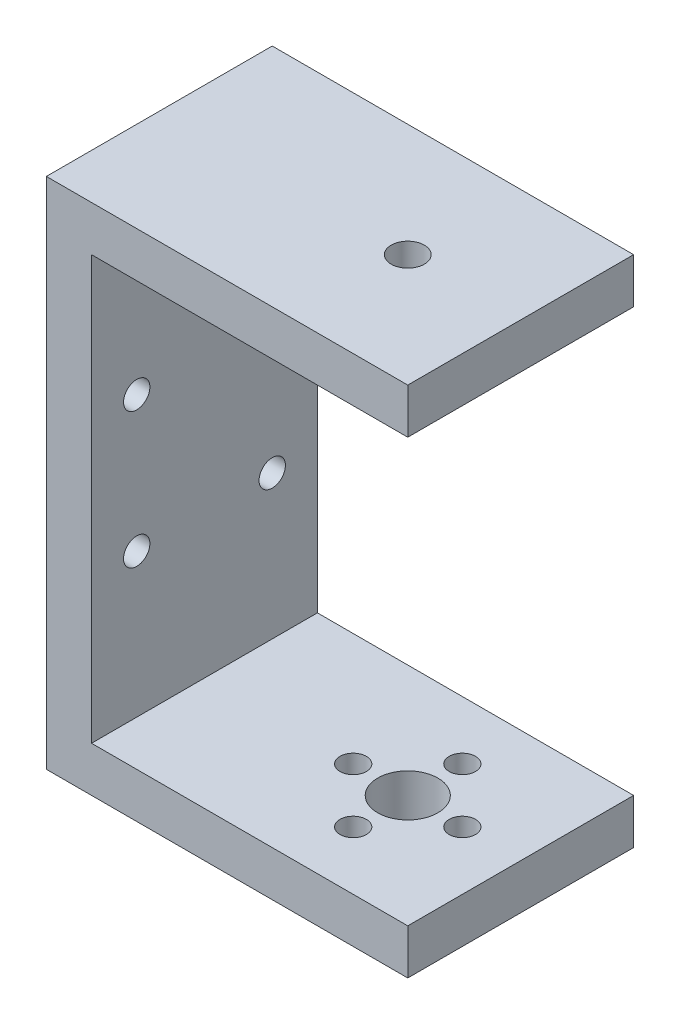
ISO-10303-21;
HEADER;
FILE_DESCRIPTION(('STEP AP214'),'2;1');
FILE_NAME('part.step','',(''),(''),'','','');
FILE_SCHEMA(('AUTOMOTIVE_DESIGN { 1 0 10303 214 1 1 1 1 }'));
ENDSEC;
DATA;
#1=APPLICATION_CONTEXT('core data for automotive mechanical design processes');
#2=APPLICATION_PROTOCOL_DEFINITION('international standard','automotive_design',2000,#1);
#3=PRODUCT_CONTEXT('',#1,'mechanical');
#4=PRODUCT('Part','Part','',(#3));
#5=PRODUCT_RELATED_PRODUCT_CATEGORY('part','',(#4));
#6=PRODUCT_DEFINITION_FORMATION('','',#4);
#7=PRODUCT_DEFINITION_CONTEXT('part definition',#1,'design');
#8=PRODUCT_DEFINITION('design','',#6,#7);
#9=PRODUCT_DEFINITION_SHAPE('','',#8);
#10=(LENGTH_UNIT() NAMED_UNIT(*) SI_UNIT(.MILLI.,.METRE.));
#11=(NAMED_UNIT(*) PLANE_ANGLE_UNIT() SI_UNIT($,.RADIAN.));
#12=(NAMED_UNIT(*) SI_UNIT($,.STERADIAN.) SOLID_ANGLE_UNIT());
#13=UNCERTAINTY_MEASURE_WITH_UNIT(LENGTH_MEASURE(1.E-05),#10,'distance_accuracy_value','');
#14=(GEOMETRIC_REPRESENTATION_CONTEXT(3) GLOBAL_UNCERTAINTY_ASSIGNED_CONTEXT((#13)) GLOBAL_UNIT_ASSIGNED_CONTEXT((#10,
#11,#12)) REPRESENTATION_CONTEXT('',''));
#15=CARTESIAN_POINT('',(0.,0.,0.));
#16=DIRECTION('',(0.,0.,1.));
#17=DIRECTION('',(1.,0.,0.));
#18=AXIS2_PLACEMENT_3D('',#15,#16,#17);
#19=CARTESIAN_POINT('',(24.,-34.1,30.));
#20=DIRECTION('',(-1.,0.,0.));
#21=DIRECTION('',(0.,0.,1.));
#22=AXIS2_PLACEMENT_3D('',#19,#20,#21);
#23=PLANE('',#22);
#24=DIRECTION('',(0.,1.,0.));
#25=VECTOR('',#24,1.);
#26=CARTESIAN_POINT('',(24.,-34.1,30.));
#27=LINE('',#26,#25);
#28=CARTESIAN_POINT('',(24.,28.1,30.));
#29=VERTEX_POINT('',#28);
#30=CARTESIAN_POINT('',(24.,34.1,30.));
#31=VERTEX_POINT('',#30);
#32=EDGE_CURVE('E87',#29,#31,#27,.T.);
#33=ORIENTED_EDGE('',*,*,#32,.F.);
#34=DIRECTION('',(0.,0.,1.));
#35=VECTOR('',#34,1.);
#36=CARTESIAN_POINT('',(24.,28.1,0.));
#37=LINE('',#36,#35);
#38=CARTESIAN_POINT('',(24.,28.1,0.));
#39=VERTEX_POINT('',#38);
#40=EDGE_CURVE('E145',#39,#29,#37,.T.);
#41=ORIENTED_EDGE('',*,*,#40,.F.);
#42=DIRECTION('',(0.,1.,0.));
#43=VECTOR('',#42,1.);
#44=CARTESIAN_POINT('',(24.,-34.1,0.));
#45=LINE('',#44,#43);
#46=CARTESIAN_POINT('',(24.,34.1,0.));
#47=VERTEX_POINT('',#46);
#48=EDGE_CURVE('E144',#39,#47,#45,.T.);
#49=ORIENTED_EDGE('',*,*,#48,.T.);
#50=DIRECTION('',(0.,0.,-1.));
#51=VECTOR('',#50,1.);
#52=CARTESIAN_POINT('',(24.,34.1,30.));
#53=LINE('',#52,#51);
#54=EDGE_CURVE('E11',#31,#47,#53,.T.);
#55=ORIENTED_EDGE('',*,*,#54,.F.);
#56=EDGE_LOOP('',(#33,#41,#49,#55));
#57=FACE_BOUND('',#56,.T.);
#58=ADVANCED_FACE('F33',(#57),#23,.F.);
#59=CARTESIAN_POINT('',(24.,-34.1,0.));
#60=VERTEX_POINT('',#59);
#61=CARTESIAN_POINT('',(24.,-28.1,0.));
#62=VERTEX_POINT('',#61);
#63=EDGE_CURVE('E156',#60,#62,#45,.T.);
#64=ORIENTED_EDGE('',*,*,#63,.T.);
#65=DIRECTION('',(0.,0.,1.));
#66=VECTOR('',#65,1.);
#67=CARTESIAN_POINT('',(24.,-28.1,0.));
#68=LINE('',#67,#66);
#69=CARTESIAN_POINT('',(24.,-28.1,30.));
#70=VERTEX_POINT('',#69);
#71=EDGE_CURVE('E50',#62,#70,#68,.T.);
#72=ORIENTED_EDGE('',*,*,#71,.T.);
#73=CARTESIAN_POINT('',(24.,-34.1,30.));
#74=VERTEX_POINT('',#73);
#75=EDGE_CURVE('E148',#74,#70,#27,.T.);
#76=ORIENTED_EDGE('',*,*,#75,.F.);
#77=DIRECTION('',(0.,0.,-1.));
#78=VECTOR('',#77,1.);
#79=CARTESIAN_POINT('',(24.,-34.1,30.));
#80=LINE('',#79,#78);
#81=EDGE_CURVE('E155',#74,#60,#80,.T.);
#82=ORIENTED_EDGE('',*,*,#81,.T.);
#83=EDGE_LOOP('',(#64,#72,#76,#82));
#84=FACE_BOUND('',#83,.T.);
#85=ADVANCED_FACE('F35',(#84),#23,.F.);
#86=CARTESIAN_POINT('',(-24.,34.1,30.));
#87=DIRECTION('',(0.,-1.,0.));
#88=DIRECTION('',(0.,0.,-1.));
#89=AXIS2_PLACEMENT_3D('',#86,#87,#88);
#90=PLANE('',#89);
#91=CARTESIAN_POINT('',(9.,34.1,15.));
#92=DIRECTION('',(0.,1.,0.));
#93=DIRECTION('',(0.,0.,1.));
#94=AXIS2_PLACEMENT_3D('',#91,#92,#93);
#95=CIRCLE('',#94,2.2);
#96=CARTESIAN_POINT('',(9.,34.1,17.2));
#97=VERTEX_POINT('',#96);
#98=EDGE_CURVE('E253',#97,#97,#95,.T.);
#99=ORIENTED_EDGE('',*,*,#98,.F.);
#100=EDGE_LOOP('',(#99));
#101=FACE_BOUND('',#100,.T.);
#102=DIRECTION('',(-1.,0.,0.));
#103=VECTOR('',#102,1.);
#104=CARTESIAN_POINT('',(-24.,34.1,0.));
#105=LINE('',#104,#103);
#106=CARTESIAN_POINT('',(-24.,34.1,0.));
#107=VERTEX_POINT('',#106);
#108=EDGE_CURVE('E158',#47,#107,#105,.T.);
#109=ORIENTED_EDGE('',*,*,#108,.T.);
#110=DIRECTION('',(0.,0.,-1.));
#111=VECTOR('',#110,1.);
#112=CARTESIAN_POINT('',(-24.,34.1,30.));
#113=LINE('',#112,#111);
#114=CARTESIAN_POINT('',(-24.,34.1,30.));
#115=VERTEX_POINT('',#114);
#116=EDGE_CURVE('E42',#115,#107,#113,.T.);
#117=ORIENTED_EDGE('',*,*,#116,.F.);
#118=DIRECTION('',(-1.,0.,0.));
#119=VECTOR('',#118,1.);
#120=CARTESIAN_POINT('',(-24.,34.1,30.));
#121=LINE('',#120,#119);
#122=EDGE_CURVE('E150',#31,#115,#121,.T.);
#123=ORIENTED_EDGE('',*,*,#122,.F.);
#124=ORIENTED_EDGE('',*,*,#54,.T.);
#125=EDGE_LOOP('',(#109,#117,#123,#124));
#126=FACE_BOUND('',#125,.T.);
#127=ADVANCED_FACE('F207',(#101,#126),#90,.F.);
#128=CARTESIAN_POINT('',(-24.,-34.1,30.));
#129=DIRECTION('',(1.,0.,0.));
#130=DIRECTION('',(0.,0.,-1.));
#131=AXIS2_PLACEMENT_3D('',#128,#129,#130);
#132=PLANE('',#131);
#133=CARTESIAN_POINT('',(-24.,9.00000000000002,24.));
#134=DIRECTION('',(1.,0.,0.));
#135=DIRECTION('',(0.,0.,1.));
#136=AXIS2_PLACEMENT_3D('',#133,#134,#135);
#137=CIRCLE('',#136,1.75);
#138=CARTESIAN_POINT('',(-24.,9.00000000000002,25.75));
#139=VERTEX_POINT('',#138);
#140=EDGE_CURVE('E330',#139,#139,#137,.T.);
#141=ORIENTED_EDGE('',*,*,#140,.T.);
#142=EDGE_LOOP('',(#141));
#143=FACE_BOUND('',#142,.T.);
#144=CARTESIAN_POINT('',(-24.,9.00000000000002,6.));
#145=DIRECTION('',(1.,0.,0.));
#146=DIRECTION('',(0.,0.,-1.));
#147=AXIS2_PLACEMENT_3D('',#144,#145,#146);
#148=CIRCLE('',#147,1.75);
#149=CARTESIAN_POINT('',(-24.,9.00000000000002,4.25));
#150=VERTEX_POINT('',#149);
#151=EDGE_CURVE('E321',#150,#150,#148,.T.);
#152=ORIENTED_EDGE('',*,*,#151,.T.);
#153=EDGE_LOOP('',(#152));
#154=FACE_BOUND('',#153,.T.);
#155=CARTESIAN_POINT('',(-24.,-9.,6.));
#156=DIRECTION('',(1.,0.,0.));
#157=DIRECTION('',(0.,0.,1.));
#158=AXIS2_PLACEMENT_3D('',#155,#156,#157);
#159=CIRCLE('',#158,1.75);
#160=CARTESIAN_POINT('',(-24.,-9.,7.75));
#161=VERTEX_POINT('',#160);
#162=EDGE_CURVE('E316',#161,#161,#159,.T.);
#163=ORIENTED_EDGE('',*,*,#162,.T.);
#164=EDGE_LOOP('',(#163));
#165=FACE_BOUND('',#164,.T.);
#166=CARTESIAN_POINT('',(-24.,-9.,24.));
#167=DIRECTION('',(1.,0.,0.));
#168=DIRECTION('',(0.,0.,-1.));
#169=AXIS2_PLACEMENT_3D('',#166,#167,#168);
#170=CIRCLE('',#169,1.75);
#171=CARTESIAN_POINT('',(-24.,-9.,22.25));
#172=VERTEX_POINT('',#171);
#173=EDGE_CURVE('E254',#172,#172,#170,.T.);
#174=ORIENTED_EDGE('',*,*,#173,.T.);
#175=EDGE_LOOP('',(#174));
#176=FACE_BOUND('',#175,.T.);
#177=DIRECTION('',(0.,-1.,0.));
#178=VECTOR('',#177,1.);
#179=CARTESIAN_POINT('',(-24.,-34.1,0.));
#180=LINE('',#179,#178);
#181=CARTESIAN_POINT('',(-24.,-34.1,0.));
#182=VERTEX_POINT('',#181);
#183=EDGE_CURVE('E160',#107,#182,#180,.T.);
#184=ORIENTED_EDGE('',*,*,#183,.T.);
#185=DIRECTION('',(0.,0.,-1.));
#186=VECTOR('',#185,1.);
#187=CARTESIAN_POINT('',(-24.,-34.1,30.));
#188=LINE('',#187,#186);
#189=CARTESIAN_POINT('',(-24.,-34.1,30.));
#190=VERTEX_POINT('',#189);
#191=EDGE_CURVE('E164',#190,#182,#188,.T.);
#192=ORIENTED_EDGE('',*,*,#191,.F.);
#193=DIRECTION('',(0.,-1.,0.));
#194=VECTOR('',#193,1.);
#195=CARTESIAN_POINT('',(-24.,-34.1,30.));
#196=LINE('',#195,#194);
#197=EDGE_CURVE('E152',#115,#190,#196,.T.);
#198=ORIENTED_EDGE('',*,*,#197,.F.);
#199=ORIENTED_EDGE('',*,*,#116,.T.);
#200=EDGE_LOOP('',(#184,#192,#198,#199));
#201=FACE_BOUND('',#200,.T.);
#202=ADVANCED_FACE('F218',(#143,#154,#165,#176,#201),#132,.F.);
#203=CARTESIAN_POINT('',(-24.,-34.1,30.));
#204=DIRECTION('',(0.,1.,0.));
#205=DIRECTION('',(0.,0.,1.));
#206=AXIS2_PLACEMENT_3D('',#203,#204,#205);
#207=PLANE('',#206);
#208=CARTESIAN_POINT('',(9.,-34.1,22.25));
#209=DIRECTION('',(0.,-1.,0.));
#210=DIRECTION('',(0.,0.,-1.));
#211=AXIS2_PLACEMENT_3D('',#208,#209,#210);
#212=CIRCLE('',#211,1.75);
#213=CARTESIAN_POINT('',(9.,-34.1,20.5));
#214=VERTEX_POINT('',#213);
#215=EDGE_CURVE('E268',#214,#214,#212,.T.);
#216=ORIENTED_EDGE('',*,*,#215,.F.);
#217=EDGE_LOOP('',(#216));
#218=FACE_BOUND('',#217,.T.);
#219=CARTESIAN_POINT('',(16.25,-34.1,15.));
#220=DIRECTION('',(0.,-1.,0.));
#221=DIRECTION('',(0.,0.,-1.));
#222=AXIS2_PLACEMENT_3D('',#219,#220,#221);
#223=CIRCLE('',#222,1.75);
#224=CARTESIAN_POINT('',(16.25,-34.1,13.25));
#225=VERTEX_POINT('',#224);
#226=EDGE_CURVE('E265',#225,#225,#223,.T.);
#227=ORIENTED_EDGE('',*,*,#226,.F.);
#228=EDGE_LOOP('',(#227));
#229=FACE_BOUND('',#228,.T.);
#230=CARTESIAN_POINT('',(9.,-34.1,7.75));
#231=DIRECTION('',(0.,-1.,0.));
#232=DIRECTION('',(0.,0.,-1.));
#233=AXIS2_PLACEMENT_3D('',#230,#231,#232);
#234=CIRCLE('',#233,1.75);
#235=CARTESIAN_POINT('',(9.,-34.1,6.));
#236=VERTEX_POINT('',#235);
#237=EDGE_CURVE('E262',#236,#236,#234,.T.);
#238=ORIENTED_EDGE('',*,*,#237,.F.);
#239=EDGE_LOOP('',(#238));
#240=FACE_BOUND('',#239,.T.);
#241=CARTESIAN_POINT('',(1.75,-34.1,15.));
#242=DIRECTION('',(0.,-1.,0.));
#243=DIRECTION('',(0.,0.,-1.));
#244=AXIS2_PLACEMENT_3D('',#241,#242,#243);
#245=CIRCLE('',#244,1.75000000000001);
#246=CARTESIAN_POINT('',(1.75,-34.1,13.25));
#247=VERTEX_POINT('',#246);
#248=EDGE_CURVE('E256',#247,#247,#245,.T.);
#249=ORIENTED_EDGE('',*,*,#248,.F.);
#250=EDGE_LOOP('',(#249));
#251=FACE_BOUND('',#250,.T.);
#252=CARTESIAN_POINT('',(9.,-34.1,15.));
#253=DIRECTION('',(0.,-1.,0.));
#254=DIRECTION('',(0.,0.,-1.));
#255=AXIS2_PLACEMENT_3D('',#252,#253,#254);
#256=CIRCLE('',#255,4.);
#257=CARTESIAN_POINT('',(9.,-34.1,11.));
#258=VERTEX_POINT('',#257);
#259=EDGE_CURVE('E135',#258,#258,#256,.T.);
#260=ORIENTED_EDGE('',*,*,#259,.F.);
#261=EDGE_LOOP('',(#260));
#262=FACE_BOUND('',#261,.T.);
#263=DIRECTION('',(1.,0.,0.));
#264=VECTOR('',#263,1.);
#265=CARTESIAN_POINT('',(-24.,-34.1,0.));
#266=LINE('',#265,#264);
#267=EDGE_CURVE('E80',#182,#60,#266,.T.);
#268=ORIENTED_EDGE('',*,*,#267,.T.);
#269=ORIENTED_EDGE('',*,*,#81,.F.);
#270=DIRECTION('',(1.,0.,0.));
#271=VECTOR('',#270,1.);
#272=CARTESIAN_POINT('',(-24.,-34.1,30.));
#273=LINE('',#272,#271);
#274=EDGE_CURVE('E59',#190,#74,#273,.T.);
#275=ORIENTED_EDGE('',*,*,#274,.F.);
#276=ORIENTED_EDGE('',*,*,#191,.T.);
#277=EDGE_LOOP('',(#268,#269,#275,#276));
#278=FACE_BOUND('',#277,.T.);
#279=ADVANCED_FACE('F220',(#218,#229,#240,#251,#262,#278),#207,.F.);
#280=CARTESIAN_POINT('',(0.,0.,30.));
#281=DIRECTION('',(0.,0.,-1.));
#282=DIRECTION('',(-1.,0.,0.));
#283=AXIS2_PLACEMENT_3D('',#280,#281,#282);
#284=PLANE('',#283);
#285=DIRECTION('',(0.,-1.,0.));
#286=VECTOR('',#285,1.);
#287=CARTESIAN_POINT('',(-18.,28.1,30.));
#288=LINE('',#287,#286);
#289=CARTESIAN_POINT('',(-18.,28.1,30.));
#290=VERTEX_POINT('',#289);
#291=CARTESIAN_POINT('',(-18.,-28.1,30.));
#292=VERTEX_POINT('',#291);
#293=EDGE_CURVE('E117',#290,#292,#288,.T.);
#294=ORIENTED_EDGE('',*,*,#293,.F.);
#295=DIRECTION('',(-1.,0.,0.));
#296=VECTOR('',#295,1.);
#297=CARTESIAN_POINT('',(-18.,28.1,30.));
#298=LINE('',#297,#296);
#299=EDGE_CURVE('E129',#29,#290,#298,.T.);
#300=ORIENTED_EDGE('',*,*,#299,.F.);
#301=ORIENTED_EDGE('',*,*,#32,.T.);
#302=ORIENTED_EDGE('',*,*,#122,.T.);
#303=ORIENTED_EDGE('',*,*,#197,.T.);
#304=ORIENTED_EDGE('',*,*,#274,.T.);
#305=ORIENTED_EDGE('',*,*,#75,.T.);
#306=DIRECTION('',(1.,0.,0.));
#307=VECTOR('',#306,1.);
#308=CARTESIAN_POINT('',(-18.,-28.1,30.));
#309=LINE('',#308,#307);
#310=EDGE_CURVE('E132',#292,#70,#309,.T.);
#311=ORIENTED_EDGE('',*,*,#310,.F.);
#312=EDGE_LOOP('',(#294,#300,#301,#302,#303,#304,#305,#311));
#313=FACE_BOUND('',#312,.T.);
#314=ADVANCED_FACE('F215',(#313),#284,.F.);
#315=CARTESIAN_POINT('',(0.,0.,0.));
#316=DIRECTION('',(0.,0.,-1.));
#317=DIRECTION('',(-1.,0.,0.));
#318=AXIS2_PLACEMENT_3D('',#315,#316,#317);
#319=PLANE('',#318);
#320=DIRECTION('',(-1.,0.,0.));
#321=VECTOR('',#320,1.);
#322=CARTESIAN_POINT('',(-18.,28.1,0.));
#323=LINE('',#322,#321);
#324=CARTESIAN_POINT('',(-18.,28.1,0.));
#325=VERTEX_POINT('',#324);
#326=EDGE_CURVE('E119',#39,#325,#323,.T.);
#327=ORIENTED_EDGE('',*,*,#326,.T.);
#328=DIRECTION('',(0.,-1.,0.));
#329=VECTOR('',#328,1.);
#330=CARTESIAN_POINT('',(-18.,28.1,0.));
#331=LINE('',#330,#329);
#332=CARTESIAN_POINT('',(-18.,-28.1,0.));
#333=VERTEX_POINT('',#332);
#334=EDGE_CURVE('E114',#325,#333,#331,.T.);
#335=ORIENTED_EDGE('',*,*,#334,.T.);
#336=DIRECTION('',(1.,0.,0.));
#337=VECTOR('',#336,1.);
#338=CARTESIAN_POINT('',(-18.,-28.1,0.));
#339=LINE('',#338,#337);
#340=EDGE_CURVE('E121',#333,#62,#339,.T.);
#341=ORIENTED_EDGE('',*,*,#340,.T.);
#342=ORIENTED_EDGE('',*,*,#63,.F.);
#343=ORIENTED_EDGE('',*,*,#267,.F.);
#344=ORIENTED_EDGE('',*,*,#183,.F.);
#345=ORIENTED_EDGE('',*,*,#108,.F.);
#346=ORIENTED_EDGE('',*,*,#48,.F.);
#347=EDGE_LOOP('',(#327,#335,#341,#342,#343,#344,#345,#346));
#348=FACE_BOUND('',#347,.T.);
#349=ADVANCED_FACE('F127',(#348),#319,.T.);
#350=CARTESIAN_POINT('',(-18.,28.1,0.));
#351=DIRECTION('',(-1.,0.,0.));
#352=DIRECTION('',(0.,0.,1.));
#353=AXIS2_PLACEMENT_3D('',#350,#351,#352);
#354=PLANE('',#353);
#355=CARTESIAN_POINT('',(-18.,9.00000000000002,24.));
#356=DIRECTION('',(1.,0.,0.));
#357=DIRECTION('',(0.,0.,1.));
#358=AXIS2_PLACEMENT_3D('',#355,#356,#357);
#359=CIRCLE('',#358,1.75);
#360=CARTESIAN_POINT('',(-18.,9.00000000000002,25.75));
#361=VERTEX_POINT('',#360);
#362=EDGE_CURVE('E333',#361,#361,#359,.T.);
#363=ORIENTED_EDGE('',*,*,#362,.F.);
#364=EDGE_LOOP('',(#363));
#365=FACE_BOUND('',#364,.T.);
#366=CARTESIAN_POINT('',(-18.,9.00000000000002,6.));
#367=DIRECTION('',(1.,0.,0.));
#368=DIRECTION('',(0.,0.,-1.));
#369=AXIS2_PLACEMENT_3D('',#366,#367,#368);
#370=CIRCLE('',#369,1.75);
#371=CARTESIAN_POINT('',(-18.,9.00000000000002,4.25));
#372=VERTEX_POINT('',#371);
#373=EDGE_CURVE('E325',#372,#372,#370,.T.);
#374=ORIENTED_EDGE('',*,*,#373,.F.);
#375=EDGE_LOOP('',(#374));
#376=FACE_BOUND('',#375,.T.);
#377=CARTESIAN_POINT('',(-18.,-9.,6.));
#378=DIRECTION('',(1.,0.,0.));
#379=DIRECTION('',(0.,0.,1.));
#380=AXIS2_PLACEMENT_3D('',#377,#378,#379);
#381=CIRCLE('',#380,1.75);
#382=CARTESIAN_POINT('',(-18.,-9.,7.75));
#383=VERTEX_POINT('',#382);
#384=EDGE_CURVE('E319',#383,#383,#381,.T.);
#385=ORIENTED_EDGE('',*,*,#384,.F.);
#386=EDGE_LOOP('',(#385));
#387=FACE_BOUND('',#386,.T.);
#388=CARTESIAN_POINT('',(-18.,-9.,24.));
#389=DIRECTION('',(1.,0.,0.));
#390=DIRECTION('',(0.,0.,-1.));
#391=AXIS2_PLACEMENT_3D('',#388,#389,#390);
#392=CIRCLE('',#391,1.75);
#393=CARTESIAN_POINT('',(-18.,-9.,22.25));
#394=VERTEX_POINT('',#393);
#395=EDGE_CURVE('E258',#394,#394,#392,.T.);
#396=ORIENTED_EDGE('',*,*,#395,.F.);
#397=EDGE_LOOP('',(#396));
#398=FACE_BOUND('',#397,.T.);
#399=ORIENTED_EDGE('',*,*,#293,.T.);
#400=DIRECTION('',(0.,0.,1.));
#401=VECTOR('',#400,1.);
#402=CARTESIAN_POINT('',(-18.,-28.1,0.));
#403=LINE('',#402,#401);
#404=EDGE_CURVE('E111',#333,#292,#403,.T.);
#405=ORIENTED_EDGE('',*,*,#404,.F.);
#406=ORIENTED_EDGE('',*,*,#334,.F.);
#407=DIRECTION('',(0.,0.,1.));
#408=VECTOR('',#407,1.);
#409=CARTESIAN_POINT('',(-18.,28.1,0.));
#410=LINE('',#409,#408);
#411=EDGE_CURVE('E142',#325,#290,#410,.T.);
#412=ORIENTED_EDGE('',*,*,#411,.T.);
#413=EDGE_LOOP('',(#399,#405,#406,#412));
#414=FACE_BOUND('',#413,.T.);
#415=ADVANCED_FACE('F112',(#365,#376,#387,#398,#414),#354,.F.);
#416=CARTESIAN_POINT('',(-18.,28.1,0.));
#417=DIRECTION('',(0.,1.,0.));
#418=DIRECTION('',(0.,0.,1.));
#419=AXIS2_PLACEMENT_3D('',#416,#417,#418);
#420=PLANE('',#419);
#421=CARTESIAN_POINT('',(9.,28.1,15.));
#422=DIRECTION('',(0.,1.,0.));
#423=DIRECTION('',(0.,0.,1.));
#424=AXIS2_PLACEMENT_3D('',#421,#422,#423);
#425=CIRCLE('',#424,2.2);
#426=CARTESIAN_POINT('',(9.,28.1,17.2));
#427=VERTEX_POINT('',#426);
#428=EDGE_CURVE('E37',#427,#427,#425,.T.);
#429=ORIENTED_EDGE('',*,*,#428,.T.);
#430=EDGE_LOOP('',(#429));
#431=FACE_BOUND('',#430,.T.);
#432=ORIENTED_EDGE('',*,*,#299,.T.);
#433=ORIENTED_EDGE('',*,*,#411,.F.);
#434=ORIENTED_EDGE('',*,*,#326,.F.);
#435=ORIENTED_EDGE('',*,*,#40,.T.);
#436=EDGE_LOOP('',(#432,#433,#434,#435));
#437=FACE_BOUND('',#436,.T.);
#438=ADVANCED_FACE('F223',(#431,#437),#420,.F.);
#439=CARTESIAN_POINT('',(-18.,-28.1,0.));
#440=DIRECTION('',(0.,-1.,0.));
#441=DIRECTION('',(0.,0.,-1.));
#442=AXIS2_PLACEMENT_3D('',#439,#440,#441);
#443=PLANE('',#442);
#444=CARTESIAN_POINT('',(9.,-28.1,22.25));
#445=DIRECTION('',(0.,-1.,0.));
#446=DIRECTION('',(0.,0.,-1.));
#447=AXIS2_PLACEMENT_3D('',#444,#445,#446);
#448=CIRCLE('',#447,1.75);
#449=CARTESIAN_POINT('',(9.,-28.1,20.5));
#450=VERTEX_POINT('',#449);
#451=EDGE_CURVE('E140',#450,#450,#448,.T.);
#452=ORIENTED_EDGE('',*,*,#451,.T.);
#453=EDGE_LOOP('',(#452));
#454=FACE_BOUND('',#453,.T.);
#455=CARTESIAN_POINT('',(16.25,-28.1,15.));
#456=DIRECTION('',(0.,-1.,0.));
#457=DIRECTION('',(0.,0.,-1.));
#458=AXIS2_PLACEMENT_3D('',#455,#456,#457);
#459=CIRCLE('',#458,1.75);
#460=CARTESIAN_POINT('',(16.25,-28.1,13.25));
#461=VERTEX_POINT('',#460);
#462=EDGE_CURVE('E177',#461,#461,#459,.T.);
#463=ORIENTED_EDGE('',*,*,#462,.T.);
#464=EDGE_LOOP('',(#463));
#465=FACE_BOUND('',#464,.T.);
#466=CARTESIAN_POINT('',(9.,-28.1,7.75));
#467=DIRECTION('',(0.,-1.,0.));
#468=DIRECTION('',(0.,0.,-1.));
#469=AXIS2_PLACEMENT_3D('',#466,#467,#468);
#470=CIRCLE('',#469,1.75);
#471=CARTESIAN_POINT('',(9.,-28.1,6.));
#472=VERTEX_POINT('',#471);
#473=EDGE_CURVE('E174',#472,#472,#470,.T.);
#474=ORIENTED_EDGE('',*,*,#473,.T.);
#475=EDGE_LOOP('',(#474));
#476=FACE_BOUND('',#475,.T.);
#477=CARTESIAN_POINT('',(1.75,-28.1,15.));
#478=DIRECTION('',(0.,-1.,0.));
#479=DIRECTION('',(0.,0.,-1.));
#480=AXIS2_PLACEMENT_3D('',#477,#478,#479);
#481=CIRCLE('',#480,1.75000000000001);
#482=CARTESIAN_POINT('',(1.75,-28.1,13.25));
#483=VERTEX_POINT('',#482);
#484=EDGE_CURVE('E171',#483,#483,#481,.T.);
#485=ORIENTED_EDGE('',*,*,#484,.T.);
#486=EDGE_LOOP('',(#485));
#487=FACE_BOUND('',#486,.T.);
#488=CARTESIAN_POINT('',(9.,-28.1,15.));
#489=DIRECTION('',(0.,-1.,0.));
#490=DIRECTION('',(0.,0.,-1.));
#491=AXIS2_PLACEMENT_3D('',#488,#489,#490);
#492=CIRCLE('',#491,4.);
#493=CARTESIAN_POINT('',(9.,-28.1,11.));
#494=VERTEX_POINT('',#493);
#495=EDGE_CURVE('E168',#494,#494,#492,.T.);
#496=ORIENTED_EDGE('',*,*,#495,.T.);
#497=EDGE_LOOP('',(#496));
#498=FACE_BOUND('',#497,.T.);
#499=ORIENTED_EDGE('',*,*,#310,.T.);
#500=ORIENTED_EDGE('',*,*,#71,.F.);
#501=ORIENTED_EDGE('',*,*,#340,.F.);
#502=ORIENTED_EDGE('',*,*,#404,.T.);
#503=EDGE_LOOP('',(#499,#500,#501,#502));
#504=FACE_BOUND('',#503,.T.);
#505=ADVANCED_FACE('F122',(#454,#465,#476,#487,#498,#504),#443,.F.);
#506=CARTESIAN_POINT('',(9.,-4.09999999999999,15.));
#507=DIRECTION('',(0.,-1.,0.));
#508=DIRECTION('',(0.,0.,-1.));
#509=AXIS2_PLACEMENT_3D('',#506,#507,#508);
#510=CYLINDRICAL_SURFACE('',#509,4.);
#511=ORIENTED_EDGE('',*,*,#259,.T.);
#512=EDGE_LOOP('',(#511));
#513=FACE_BOUND('',#512,.T.);
#514=ORIENTED_EDGE('',*,*,#495,.F.);
#515=EDGE_LOOP('',(#514));
#516=FACE_BOUND('',#515,.T.);
#517=ADVANCED_FACE('F231',(#513,#516),#510,.F.);
#518=CARTESIAN_POINT('',(1.75,-4.09999999999999,15.));
#519=DIRECTION('',(0.,-1.,0.));
#520=DIRECTION('',(0.,0.,-1.));
#521=AXIS2_PLACEMENT_3D('',#518,#519,#520);
#522=CYLINDRICAL_SURFACE('',#521,1.75000000000001);
#523=ORIENTED_EDGE('',*,*,#248,.T.);
#524=EDGE_LOOP('',(#523));
#525=FACE_BOUND('',#524,.T.);
#526=ORIENTED_EDGE('',*,*,#484,.F.);
#527=EDGE_LOOP('',(#526));
#528=FACE_BOUND('',#527,.T.);
#529=ADVANCED_FACE('F283',(#525,#528),#522,.F.);
#530=CARTESIAN_POINT('',(9.,-4.09999999999999,7.75));
#531=DIRECTION('',(0.,-1.,0.));
#532=DIRECTION('',(0.,0.,-1.));
#533=AXIS2_PLACEMENT_3D('',#530,#531,#532);
#534=CYLINDRICAL_SURFACE('',#533,1.75);
#535=ORIENTED_EDGE('',*,*,#237,.T.);
#536=EDGE_LOOP('',(#535));
#537=FACE_BOUND('',#536,.T.);
#538=ORIENTED_EDGE('',*,*,#473,.F.);
#539=EDGE_LOOP('',(#538));
#540=FACE_BOUND('',#539,.T.);
#541=ADVANCED_FACE('F197',(#537,#540),#534,.F.);
#542=CARTESIAN_POINT('',(16.25,-4.09999999999999,15.));
#543=DIRECTION('',(0.,-1.,0.));
#544=DIRECTION('',(0.,0.,-1.));
#545=AXIS2_PLACEMENT_3D('',#542,#543,#544);
#546=CYLINDRICAL_SURFACE('',#545,1.75);
#547=ORIENTED_EDGE('',*,*,#226,.T.);
#548=EDGE_LOOP('',(#547));
#549=FACE_BOUND('',#548,.T.);
#550=ORIENTED_EDGE('',*,*,#462,.F.);
#551=EDGE_LOOP('',(#550));
#552=FACE_BOUND('',#551,.T.);
#553=ADVANCED_FACE('F187',(#549,#552),#546,.F.);
#554=CARTESIAN_POINT('',(9.,-4.09999999999999,22.25));
#555=DIRECTION('',(0.,-1.,0.));
#556=DIRECTION('',(0.,0.,-1.));
#557=AXIS2_PLACEMENT_3D('',#554,#555,#556);
#558=CYLINDRICAL_SURFACE('',#557,1.75);
#559=ORIENTED_EDGE('',*,*,#215,.T.);
#560=EDGE_LOOP('',(#559));
#561=FACE_BOUND('',#560,.T.);
#562=ORIENTED_EDGE('',*,*,#451,.F.);
#563=EDGE_LOOP('',(#562));
#564=FACE_BOUND('',#563,.T.);
#565=ADVANCED_FACE('F184',(#561,#564),#558,.F.);
#566=CARTESIAN_POINT('',(9.,4.10000000000001,15.));
#567=DIRECTION('',(0.,1.,0.));
#568=DIRECTION('',(0.,0.,1.));
#569=AXIS2_PLACEMENT_3D('',#566,#567,#568);
#570=CYLINDRICAL_SURFACE('',#569,2.2);
#571=ORIENTED_EDGE('',*,*,#98,.T.);
#572=EDGE_LOOP('',(#571));
#573=FACE_BOUND('',#572,.T.);
#574=ORIENTED_EDGE('',*,*,#428,.F.);
#575=EDGE_LOOP('',(#574));
#576=FACE_BOUND('',#575,.T.);
#577=ADVANCED_FACE('F186',(#573,#576),#570,.F.);
#578=CARTESIAN_POINT('',(-24.,-9.,24.));
#579=DIRECTION('',(1.,0.,0.));
#580=DIRECTION('',(0.,0.,-1.));
#581=AXIS2_PLACEMENT_3D('',#578,#579,#580);
#582=CYLINDRICAL_SURFACE('',#581,1.75);
#583=ORIENTED_EDGE('',*,*,#173,.F.);
#584=EDGE_LOOP('',(#583));
#585=FACE_BOUND('',#584,.T.);
#586=ORIENTED_EDGE('',*,*,#395,.T.);
#587=EDGE_LOOP('',(#586));
#588=FACE_BOUND('',#587,.T.);
#589=ADVANCED_FACE('F194',(#585,#588),#582,.F.);
#590=CARTESIAN_POINT('',(-24.,-9.,6.));
#591=DIRECTION('',(1.,0.,0.));
#592=DIRECTION('',(0.,0.,-1.));
#593=AXIS2_PLACEMENT_3D('',#590,#591,#592);
#594=CYLINDRICAL_SURFACE('',#593,1.75);
#595=ORIENTED_EDGE('',*,*,#162,.F.);
#596=EDGE_LOOP('',(#595));
#597=FACE_BOUND('',#596,.T.);
#598=ORIENTED_EDGE('',*,*,#384,.T.);
#599=EDGE_LOOP('',(#598));
#600=FACE_BOUND('',#599,.T.);
#601=ADVANCED_FACE('F299',(#597,#600),#594,.F.);
#602=CARTESIAN_POINT('',(-24.,9.00000000000002,6.));
#603=DIRECTION('',(1.,0.,0.));
#604=DIRECTION('',(0.,0.,-1.));
#605=AXIS2_PLACEMENT_3D('',#602,#603,#604);
#606=CYLINDRICAL_SURFACE('',#605,1.75);
#607=ORIENTED_EDGE('',*,*,#151,.F.);
#608=EDGE_LOOP('',(#607));
#609=FACE_BOUND('',#608,.T.);
#610=ORIENTED_EDGE('',*,*,#373,.T.);
#611=EDGE_LOOP('',(#610));
#612=FACE_BOUND('',#611,.T.);
#613=ADVANCED_FACE('F304',(#609,#612),#606,.F.);
#614=CARTESIAN_POINT('',(-24.,9.00000000000002,24.));
#615=DIRECTION('',(1.,0.,0.));
#616=DIRECTION('',(0.,0.,-1.));
#617=AXIS2_PLACEMENT_3D('',#614,#615,#616);
#618=CYLINDRICAL_SURFACE('',#617,1.75);
#619=ORIENTED_EDGE('',*,*,#140,.F.);
#620=EDGE_LOOP('',(#619));
#621=FACE_BOUND('',#620,.T.);
#622=ORIENTED_EDGE('',*,*,#362,.T.);
#623=EDGE_LOOP('',(#622));
#624=FACE_BOUND('',#623,.T.);
#625=ADVANCED_FACE('F301',(#621,#624),#618,.F.);
#626=CLOSED_SHELL('',(#58,#85,#127,#202,#279,#314,#349,#415,#438,#505,#517,#529,#541,#553,#565,
#577,#589,#601,#613,#625));
#627=MANIFOLD_SOLID_BREP('B2',#626);
#628=ADVANCED_BREP_SHAPE_REPRESENTATION('',(#18,#627),#14);
#629=SHAPE_DEFINITION_REPRESENTATION(#9,#628);
ENDSEC;
END-ISO-10303-21;
